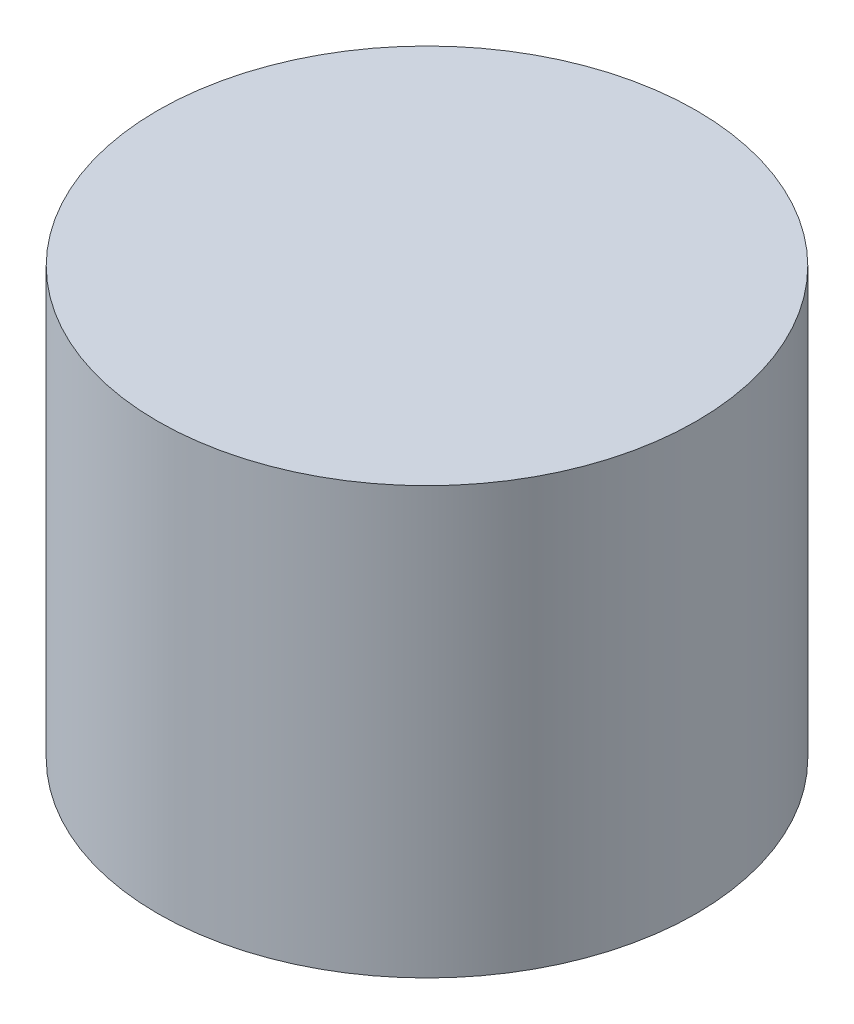
ISO-10303-21;
HEADER;
FILE_DESCRIPTION(('STEP AP214'),'2;1');
FILE_NAME('part.step','',(''),(''),'','','');
FILE_SCHEMA(('AUTOMOTIVE_DESIGN { 1 0 10303 214 1 1 1 1 }'));
ENDSEC;
DATA;
#1=APPLICATION_CONTEXT('core data for automotive mechanical design processes');
#2=APPLICATION_PROTOCOL_DEFINITION('international standard','automotive_design',2000,#1);
#3=PRODUCT_CONTEXT('',#1,'mechanical');
#4=PRODUCT('Part','Part','',(#3));
#5=PRODUCT_RELATED_PRODUCT_CATEGORY('part','',(#4));
#6=PRODUCT_DEFINITION_FORMATION('','',#4);
#7=PRODUCT_DEFINITION_CONTEXT('part definition',#1,'design');
#8=PRODUCT_DEFINITION('design','',#6,#7);
#9=PRODUCT_DEFINITION_SHAPE('','',#8);
#10=(LENGTH_UNIT() NAMED_UNIT(*) SI_UNIT(.MILLI.,.METRE.));
#11=(NAMED_UNIT(*) PLANE_ANGLE_UNIT() SI_UNIT($,.RADIAN.));
#12=(NAMED_UNIT(*) SI_UNIT($,.STERADIAN.) SOLID_ANGLE_UNIT());
#13=UNCERTAINTY_MEASURE_WITH_UNIT(LENGTH_MEASURE(1.E-05),#10,'distance_accuracy_value','');
#14=(GEOMETRIC_REPRESENTATION_CONTEXT(3) GLOBAL_UNCERTAINTY_ASSIGNED_CONTEXT((#13)) GLOBAL_UNIT_ASSIGNED_CONTEXT((#10,
#11,#12)) REPRESENTATION_CONTEXT('',''));
#15=CARTESIAN_POINT('',(0.,0.,0.));
#16=DIRECTION('',(0.,0.,1.));
#17=DIRECTION('',(1.,0.,0.));
#18=AXIS2_PLACEMENT_3D('',#15,#16,#17);
#19=CARTESIAN_POINT('',(0.,9.5,0.));
#20=DIRECTION('',(0.,-1.,0.));
#21=DIRECTION('',(0.,0.,-1.));
#22=AXIS2_PLACEMENT_3D('',#19,#20,#21);
#23=CYLINDRICAL_SURFACE('',#22,6.);
#24=CARTESIAN_POINT('',(0.,9.5,0.));
#25=DIRECTION('',(0.,1.,0.));
#26=DIRECTION('',(0.,0.,1.));
#27=AXIS2_PLACEMENT_3D('',#24,#25,#26);
#28=CIRCLE('',#27,6.);
#29=CARTESIAN_POINT('',(0.,9.5,6.));
#30=VERTEX_POINT('',#29);
#31=EDGE_CURVE('E10',#30,#30,#28,.T.);
#32=ORIENTED_EDGE('',*,*,#31,.F.);
#33=EDGE_LOOP('',(#32));
#34=FACE_BOUND('',#33,.T.);
#35=CARTESIAN_POINT('',(0.,0.,0.));
#36=DIRECTION('',(0.,1.,0.));
#37=DIRECTION('',(0.,0.,1.));
#38=AXIS2_PLACEMENT_3D('',#35,#36,#37);
#39=CIRCLE('',#38,6.);
#40=CARTESIAN_POINT('',(0.,0.,6.));
#41=VERTEX_POINT('',#40);
#42=EDGE_CURVE('E34',#41,#41,#39,.T.);
#43=ORIENTED_EDGE('',*,*,#42,.T.);
#44=EDGE_LOOP('',(#43));
#45=FACE_BOUND('',#44,.T.);
#46=ADVANCED_FACE('F31',(#34,#45),#23,.T.);
#47=CARTESIAN_POINT('',(0.,9.5,0.));
#48=DIRECTION('',(0.,1.,0.));
#49=DIRECTION('',(0.,0.,1.));
#50=AXIS2_PLACEMENT_3D('',#47,#48,#49);
#51=PLANE('',#50);
#52=ORIENTED_EDGE('',*,*,#31,.T.);
#53=EDGE_LOOP('',(#52));
#54=FACE_BOUND('',#53,.T.);
#55=ADVANCED_FACE('F46',(#54),#51,.T.);
#56=CARTESIAN_POINT('',(0.,0.,0.));
#57=DIRECTION('',(0.,1.,0.));
#58=DIRECTION('',(0.,0.,1.));
#59=AXIS2_PLACEMENT_3D('',#56,#57,#58);
#60=PLANE('',#59);
#61=ORIENTED_EDGE('',*,*,#42,.F.);
#62=EDGE_LOOP('',(#61));
#63=FACE_BOUND('',#62,.T.);
#64=ADVANCED_FACE('F44',(#63),#60,.F.);
#65=CLOSED_SHELL('',(#46,#55,#64));
#66=MANIFOLD_SOLID_BREP('B2',#65);
#67=ADVANCED_BREP_SHAPE_REPRESENTATION('',(#18,#66),#14);
#68=SHAPE_DEFINITION_REPRESENTATION(#9,#67);
ENDSEC;
END-ISO-10303-21;
